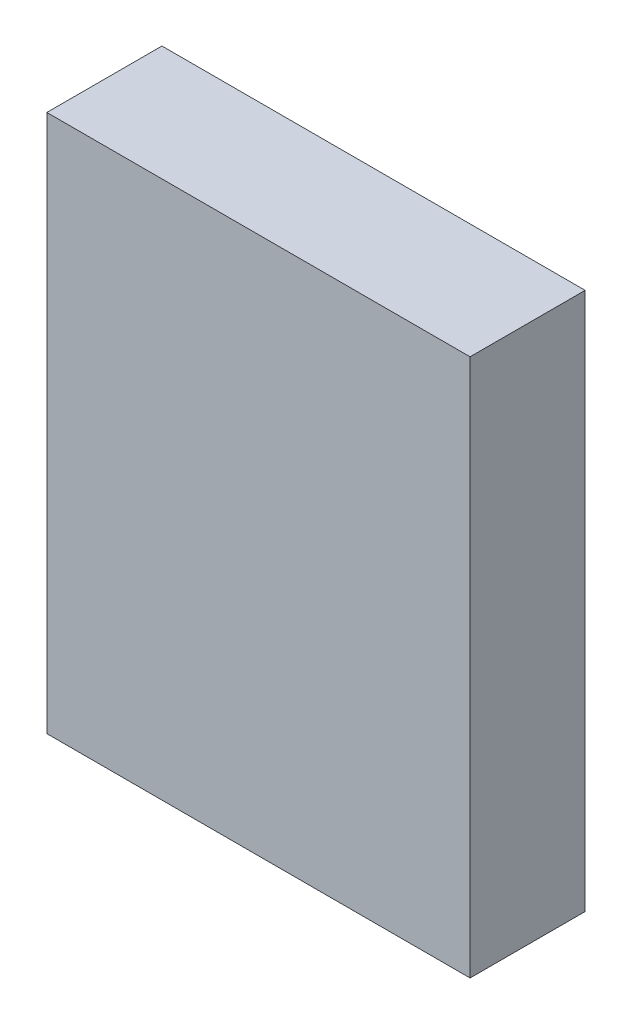
ISO-10303-21;
HEADER;
FILE_DESCRIPTION(('STEP AP214'),'2;1');
FILE_NAME('part.step','',(''),(''),'','','');
FILE_SCHEMA(('AUTOMOTIVE_DESIGN { 1 0 10303 214 1 1 1 1 }'));
ENDSEC;
DATA;
#1=APPLICATION_CONTEXT('core data for automotive mechanical design processes');
#2=APPLICATION_PROTOCOL_DEFINITION('international standard','automotive_design',2000,#1);
#3=PRODUCT_CONTEXT('',#1,'mechanical');
#4=PRODUCT('Part','Part','',(#3));
#5=PRODUCT_RELATED_PRODUCT_CATEGORY('part','',(#4));
#6=PRODUCT_DEFINITION_FORMATION('','',#4);
#7=PRODUCT_DEFINITION_CONTEXT('part definition',#1,'design');
#8=PRODUCT_DEFINITION('design','',#6,#7);
#9=PRODUCT_DEFINITION_SHAPE('','',#8);
#10=(LENGTH_UNIT() NAMED_UNIT(*) SI_UNIT(.MILLI.,.METRE.));
#11=(NAMED_UNIT(*) PLANE_ANGLE_UNIT() SI_UNIT($,.RADIAN.));
#12=(NAMED_UNIT(*) SI_UNIT($,.STERADIAN.) SOLID_ANGLE_UNIT());
#13=UNCERTAINTY_MEASURE_WITH_UNIT(LENGTH_MEASURE(1.E-05),#10,'distance_accuracy_value','');
#14=(GEOMETRIC_REPRESENTATION_CONTEXT(3) GLOBAL_UNCERTAINTY_ASSIGNED_CONTEXT((#13)) GLOBAL_UNIT_ASSIGNED_CONTEXT((#10,
#11,#12)) REPRESENTATION_CONTEXT('',''));
#15=CARTESIAN_POINT('',(0.,0.,0.));
#16=DIRECTION('',(0.,0.,1.));
#17=DIRECTION('',(1.,0.,0.));
#18=AXIS2_PLACEMENT_3D('',#15,#16,#17);
#19=CARTESIAN_POINT('',(0.,0.,0.750000000000048));
#20=DIRECTION('',(0.,0.,1.));
#21=DIRECTION('',(1.,0.,0.));
#22=AXIS2_PLACEMENT_3D('',#19,#20,#21);
#23=PLANE('',#22);
#24=DIRECTION('',(0.,1.,0.));
#25=VECTOR('',#24,1.);
#26=CARTESIAN_POINT('',(-1.37500000000009,1.75600000000009,0.750000000000048));
#27=LINE('',#26,#25);
#28=CARTESIAN_POINT('',(-1.37500000000009,-1.75000000000011,0.750000000000048));
#29=VERTEX_POINT('',#28);
#30=CARTESIAN_POINT('',(-1.37500000000009,1.75600000000009,0.750000000000048));
#31=VERTEX_POINT('',#30);
#32=EDGE_CURVE('E68',#29,#31,#27,.T.);
#33=ORIENTED_EDGE('',*,*,#32,.F.);
#34=DIRECTION('',(1.,0.,0.));
#35=VECTOR('',#34,1.);
#36=CARTESIAN_POINT('',(-1.37500000000009,-1.75000000000011,0.750000000000048));
#37=LINE('',#36,#35);
#38=CARTESIAN_POINT('',(1.38300000000006,-1.75000000000011,0.750000000000048));
#39=VERTEX_POINT('',#38);
#40=EDGE_CURVE('E20',#39,#29,#37,.F.);
#41=ORIENTED_EDGE('',*,*,#40,.F.);
#42=DIRECTION('',(0.,1.,0.));
#43=VECTOR('',#42,1.);
#44=CARTESIAN_POINT('',(1.38300000000006,-1.75000000000011,0.750000000000048));
#45=LINE('',#44,#43);
#46=CARTESIAN_POINT('',(1.38300000000006,1.75600000000009,0.750000000000048));
#47=VERTEX_POINT('',#46);
#48=EDGE_CURVE('E58',#47,#39,#45,.F.);
#49=ORIENTED_EDGE('',*,*,#48,.F.);
#50=DIRECTION('',(1.,0.,0.));
#51=VECTOR('',#50,1.);
#52=CARTESIAN_POINT('',(1.38300000000006,1.75600000000009,0.750000000000048));
#53=LINE('',#52,#51);
#54=EDGE_CURVE('E53',#31,#47,#53,.T.);
#55=ORIENTED_EDGE('',*,*,#54,.F.);
#56=EDGE_LOOP('',(#33,#41,#49,#55));
#57=FACE_BOUND('',#56,.T.);
#58=ADVANCED_FACE('F17',(#57),#23,.T.);
#59=CARTESIAN_POINT('',(-1.37500000000009,-1.75000000000011,0.));
#60=DIRECTION('',(0.,-1.,0.));
#61=DIRECTION('',(0.,0.,-1.));
#62=AXIS2_PLACEMENT_3D('',#59,#60,#61);
#63=PLANE('',#62);
#64=DIRECTION('',(0.,0.,1.));
#65=VECTOR('',#64,1.);
#66=CARTESIAN_POINT('',(-1.37500000000009,-1.75000000000011,0.));
#67=LINE('',#66,#65);
#68=CARTESIAN_POINT('',(-1.37500000000009,-1.75000000000011,0.));
#69=VERTEX_POINT('',#68);
#70=EDGE_CURVE('E79',#69,#29,#67,.T.);
#71=ORIENTED_EDGE('',*,*,#70,.F.);
#72=DIRECTION('',(1.,0.,0.));
#73=VECTOR('',#72,1.);
#74=CARTESIAN_POINT('',(0.,-1.75000000000011,0.));
#75=LINE('',#74,#73);
#76=CARTESIAN_POINT('',(1.38300000000006,-1.75000000000011,0.));
#77=VERTEX_POINT('',#76);
#78=EDGE_CURVE('E74',#69,#77,#75,.T.);
#79=ORIENTED_EDGE('',*,*,#78,.T.);
#80=DIRECTION('',(0.,0.,-1.));
#81=VECTOR('',#80,1.);
#82=CARTESIAN_POINT('',(1.38300000000006,-1.75000000000011,0.));
#83=LINE('',#82,#81);
#84=EDGE_CURVE('E63',#39,#77,#83,.T.);
#85=ORIENTED_EDGE('',*,*,#84,.F.);
#86=ORIENTED_EDGE('',*,*,#40,.T.);
#87=EDGE_LOOP('',(#71,#79,#85,#86));
#88=FACE_BOUND('',#87,.T.);
#89=ADVANCED_FACE('F73',(#88),#63,.T.);
#90=CARTESIAN_POINT('',(1.38300000000006,-1.75000000000011,0.));
#91=DIRECTION('',(1.,0.,0.));
#92=DIRECTION('',(0.,0.,-1.));
#93=AXIS2_PLACEMENT_3D('',#90,#91,#92);
#94=PLANE('',#93);
#95=ORIENTED_EDGE('',*,*,#84,.T.);
#96=DIRECTION('',(0.,1.,0.));
#97=VECTOR('',#96,1.);
#98=CARTESIAN_POINT('',(1.38300000000006,0.,0.));
#99=LINE('',#98,#97);
#100=CARTESIAN_POINT('',(1.38300000000006,1.75600000000009,0.));
#101=VERTEX_POINT('',#100);
#102=EDGE_CURVE('E84',#77,#101,#99,.T.);
#103=ORIENTED_EDGE('',*,*,#102,.T.);
#104=DIRECTION('',(0.,0.,1.));
#105=VECTOR('',#104,1.);
#106=CARTESIAN_POINT('',(1.38300000000006,1.75600000000009,0.));
#107=LINE('',#106,#105);
#108=EDGE_CURVE('E65',#47,#101,#107,.F.);
#109=ORIENTED_EDGE('',*,*,#108,.F.);
#110=ORIENTED_EDGE('',*,*,#48,.T.);
#111=EDGE_LOOP('',(#95,#103,#109,#110));
#112=FACE_BOUND('',#111,.T.);
#113=ADVANCED_FACE('F60',(#112),#94,.T.);
#114=CARTESIAN_POINT('',(1.38300000000006,1.75600000000009,0.));
#115=DIRECTION('',(0.,1.,0.));
#116=DIRECTION('',(0.,0.,1.));
#117=AXIS2_PLACEMENT_3D('',#114,#115,#116);
#118=PLANE('',#117);
#119=ORIENTED_EDGE('',*,*,#108,.T.);
#120=DIRECTION('',(1.,0.,0.));
#121=VECTOR('',#120,1.);
#122=CARTESIAN_POINT('',(0.,1.75600000000009,0.));
#123=LINE('',#122,#121);
#124=CARTESIAN_POINT('',(-1.37500000000009,1.75600000000009,0.));
#125=VERTEX_POINT('',#124);
#126=EDGE_CURVE('E26',#101,#125,#123,.F.);
#127=ORIENTED_EDGE('',*,*,#126,.T.);
#128=DIRECTION('',(0.,0.,1.));
#129=VECTOR('',#128,1.);
#130=CARTESIAN_POINT('',(-1.37500000000009,1.75600000000009,0.));
#131=LINE('',#130,#129);
#132=EDGE_CURVE('E34',#31,#125,#131,.F.);
#133=ORIENTED_EDGE('',*,*,#132,.F.);
#134=ORIENTED_EDGE('',*,*,#54,.T.);
#135=EDGE_LOOP('',(#119,#127,#133,#134));
#136=FACE_BOUND('',#135,.T.);
#137=ADVANCED_FACE('F88',(#136),#118,.T.);
#138=CARTESIAN_POINT('',(-1.37500000000009,1.75600000000009,0.));
#139=DIRECTION('',(-1.,0.,0.));
#140=DIRECTION('',(0.,0.,1.));
#141=AXIS2_PLACEMENT_3D('',#138,#139,#140);
#142=PLANE('',#141);
#143=ORIENTED_EDGE('',*,*,#132,.T.);
#144=DIRECTION('',(0.,1.,0.));
#145=VECTOR('',#144,1.);
#146=CARTESIAN_POINT('',(-1.37500000000009,0.,0.));
#147=LINE('',#146,#145);
#148=EDGE_CURVE('E11',#125,#69,#147,.F.);
#149=ORIENTED_EDGE('',*,*,#148,.T.);
#150=ORIENTED_EDGE('',*,*,#70,.T.);
#151=ORIENTED_EDGE('',*,*,#32,.T.);
#152=EDGE_LOOP('',(#143,#149,#150,#151));
#153=FACE_BOUND('',#152,.T.);
#154=ADVANCED_FACE('F91',(#153),#142,.T.);
#155=CARTESIAN_POINT('',(0.,0.,0.));
#156=DIRECTION('',(0.,0.,1.));
#157=DIRECTION('',(1.,0.,0.));
#158=AXIS2_PLACEMENT_3D('',#155,#156,#157);
#159=PLANE('',#158);
#160=ORIENTED_EDGE('',*,*,#126,.F.);
#161=ORIENTED_EDGE('',*,*,#102,.F.);
#162=ORIENTED_EDGE('',*,*,#78,.F.);
#163=ORIENTED_EDGE('',*,*,#148,.F.);
#164=EDGE_LOOP('',(#160,#161,#162,#163));
#165=FACE_BOUND('',#164,.T.);
#166=ADVANCED_FACE('F90',(#165),#159,.F.);
#167=CLOSED_SHELL('',(#58,#89,#113,#137,#154,#166));
#168=MANIFOLD_SOLID_BREP('B1',#167);
#169=ADVANCED_BREP_SHAPE_REPRESENTATION('',(#18,#168),#14);
#170=SHAPE_DEFINITION_REPRESENTATION(#9,#169);
ENDSEC;
END-ISO-10303-21;
